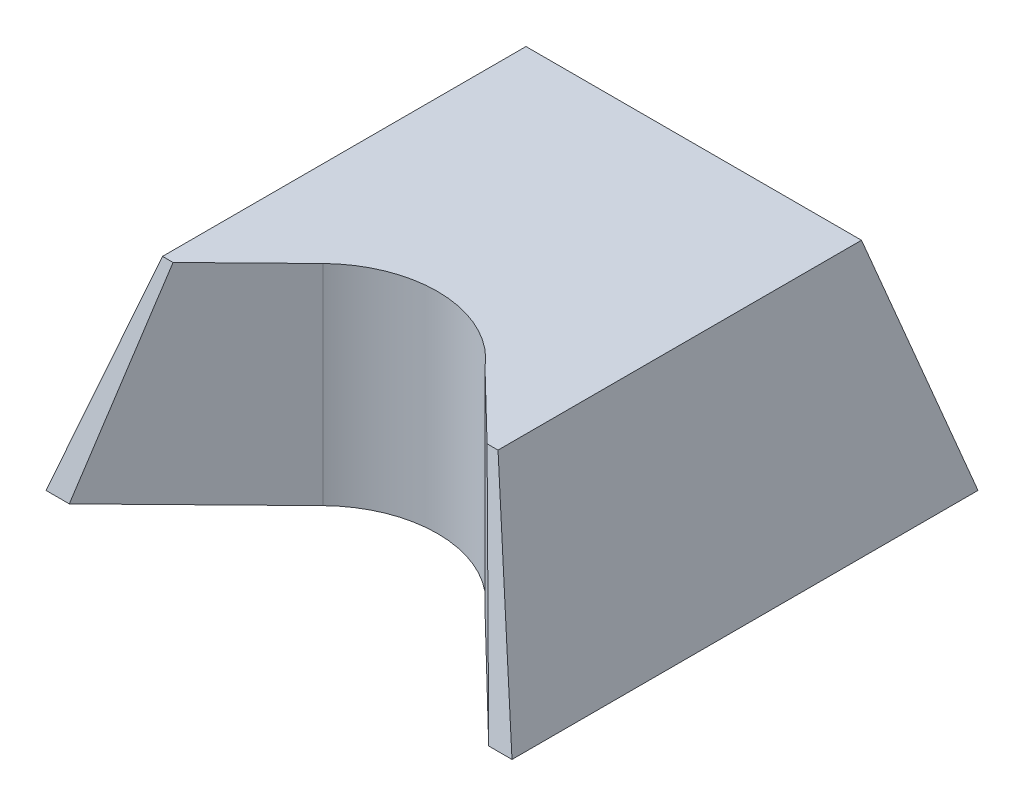
ISO-10303-21;
HEADER;
FILE_DESCRIPTION(('STEP AP214'),'2;1');
FILE_NAME('part.step','',(''),(''),'','','');
FILE_SCHEMA(('AUTOMOTIVE_DESIGN { 1 0 10303 214 1 1 1 1 }'));
ENDSEC;
DATA;
#1=APPLICATION_CONTEXT('core data for automotive mechanical design processes');
#2=APPLICATION_PROTOCOL_DEFINITION('international standard','automotive_design',2000,#1);
#3=PRODUCT_CONTEXT('',#1,'mechanical');
#4=PRODUCT('Part','Part','',(#3));
#5=PRODUCT_RELATED_PRODUCT_CATEGORY('part','',(#4));
#6=PRODUCT_DEFINITION_FORMATION('','',#4);
#7=PRODUCT_DEFINITION_CONTEXT('part definition',#1,'design');
#8=PRODUCT_DEFINITION('design','',#6,#7);
#9=PRODUCT_DEFINITION_SHAPE('','',#8);
#10=(LENGTH_UNIT() NAMED_UNIT(*) SI_UNIT(.MILLI.,.METRE.));
#11=(NAMED_UNIT(*) PLANE_ANGLE_UNIT() SI_UNIT($,.RADIAN.));
#12=(NAMED_UNIT(*) SI_UNIT($,.STERADIAN.) SOLID_ANGLE_UNIT());
#13=UNCERTAINTY_MEASURE_WITH_UNIT(LENGTH_MEASURE(1.E-05),#10,'distance_accuracy_value','');
#14=(GEOMETRIC_REPRESENTATION_CONTEXT(3) GLOBAL_UNCERTAINTY_ASSIGNED_CONTEXT((#13)) GLOBAL_UNIT_ASSIGNED_CONTEXT((#10,
#11,#12)) REPRESENTATION_CONTEXT('',''));
#15=CARTESIAN_POINT('',(0.,0.,0.));
#16=DIRECTION('',(0.,0.,1.));
#17=DIRECTION('',(1.,0.,0.));
#18=AXIS2_PLACEMENT_3D('',#15,#16,#17);
#19=CARTESIAN_POINT('',(50.,45.,-9.));
#20=DIRECTION('',(0.,-1.,0.));
#21=DIRECTION('',(0.,0.,-1.));
#22=AXIS2_PLACEMENT_3D('',#19,#20,#21);
#23=CYLINDRICAL_SURFACE('',#22,26.75);
#24=CARTESIAN_POINT('',(50.,0.,-9.));
#25=DIRECTION('',(0.,-1.,0.));
#26=DIRECTION('',(0.,0.,-1.));
#27=AXIS2_PLACEMENT_3D('',#24,#25,#26);
#28=CIRCLE('',#27,26.75);
#29=CARTESIAN_POINT('',(31.311151046317,0.,-28.1386892128594));
#30=VERTEX_POINT('',#29);
#31=CARTESIAN_POINT('',(70.5138595947822,0.,-26.1681118509159));
#32=VERTEX_POINT('',#31);
#33=EDGE_CURVE('E408',#30,#32,#28,.T.);
#34=ORIENTED_EDGE('',*,*,#33,.F.);
#35=DIRECTION('',(0.,-1.,0.));
#36=VECTOR('',#35,1.);
#37=CARTESIAN_POINT('',(31.311151046317,45.,-28.1386892128594));
#38=LINE('',#37,#36);
#39=CARTESIAN_POINT('',(31.311151046317,43.25,-28.1386892128594));
#40=VERTEX_POINT('',#39);
#41=EDGE_CURVE('E378',#40,#30,#38,.T.);
#42=ORIENTED_EDGE('',*,*,#41,.F.);
#43=CARTESIAN_POINT('',(50.,43.25,-9.));
#44=DIRECTION('',(0.,1.,0.));
#45=DIRECTION('',(0.,0.,1.));
#46=AXIS2_PLACEMENT_3D('',#43,#44,#45);
#47=CIRCLE('',#46,26.75);
#48=CARTESIAN_POINT('',(70.5138595947822,43.25,-26.1681118509159));
#49=VERTEX_POINT('',#48);
#50=EDGE_CURVE('E371',#40,#49,#47,.F.);
#51=ORIENTED_EDGE('',*,*,#50,.T.);
#52=DIRECTION('',(0.,-1.,0.));
#53=VECTOR('',#52,1.);
#54=CARTESIAN_POINT('',(70.5138595947822,43.25,-26.1681118509159));
#55=LINE('',#54,#53);
#56=EDGE_CURVE('E386',#49,#32,#55,.T.);
#57=ORIENTED_EDGE('',*,*,#56,.T.);
#58=EDGE_LOOP('',(#34,#42,#51,#57));
#59=FACE_BOUND('',#58,.T.);
#60=DIRECTION('',(0.,-1.,0.));
#61=VECTOR('',#60,1.);
#62=CARTESIAN_POINT('',(55.,15.75,-35.2785558963958));
#63=LINE('',#62,#61);
#64=CARTESIAN_POINT('',(55.,15.75,-35.2785558963958));
#65=VERTEX_POINT('',#64);
#66=CARTESIAN_POINT('',(55.,12.75,-35.2785558963958));
#67=VERTEX_POINT('',#66);
#68=EDGE_CURVE('E59',#65,#67,#63,.T.);
#69=ORIENTED_EDGE('',*,*,#68,.F.);
#70=CARTESIAN_POINT('',(50.,15.75,-8.99999999999898));
#71=DIRECTION('',(0.,1.,0.));
#72=DIRECTION('',(0.,0.,-1.));
#73=AXIS2_PLACEMENT_3D('',#70,#71,#72);
#74=CIRCLE('',#73,26.750000000001);
#75=CARTESIAN_POINT('',(45.,15.75,-35.2785558963958));
#76=VERTEX_POINT('',#75);
#77=EDGE_CURVE('E290',#65,#76,#74,.T.);
#78=ORIENTED_EDGE('',*,*,#77,.T.);
#79=DIRECTION('',(0.,-1.,0.));
#80=VECTOR('',#79,1.);
#81=CARTESIAN_POINT('',(45.,15.75,-35.2785558963958));
#82=LINE('',#81,#80);
#83=CARTESIAN_POINT('',(45.,12.75,-35.2785558963958));
#84=VERTEX_POINT('',#83);
#85=EDGE_CURVE('E302',#76,#84,#82,.T.);
#86=ORIENTED_EDGE('',*,*,#85,.T.);
#87=CARTESIAN_POINT('',(50.,12.75,-8.99999999999898));
#88=DIRECTION('',(0.,1.,0.));
#89=DIRECTION('',(0.,0.,-1.));
#90=AXIS2_PLACEMENT_3D('',#87,#88,#89);
#91=CIRCLE('',#90,26.750000000001);
#92=EDGE_CURVE('E282',#67,#84,#91,.T.);
#93=ORIENTED_EDGE('',*,*,#92,.F.);
#94=EDGE_LOOP('',(#69,#78,#86,#93));
#95=FACE_BOUND('',#94,.T.);
#96=ADVANCED_FACE('F35',(#59,#95),#23,.T.);
#97=CARTESIAN_POINT('',(100.,-0.415542908334733,-98.3000517386306));
#98=DIRECTION('',(0.,0.23745309047699,-0.971399006496778));
#99=DIRECTION('',(0.,0.971399006496778,0.23745309047699));
#100=AXIS2_PLACEMENT_3D('',#97,#98,#99);
#101=PLANE('',#100);
#102=DIRECTION('',(-1.,0.,0.));
#103=VECTOR('',#102,1.);
#104=CARTESIAN_POINT('',(86.,43.25,-87.6262523610377));
#105=LINE('',#104,#103);
#106=CARTESIAN_POINT('',(84.7117088516525,43.25,-87.6262523610377));
#107=VERTEX_POINT('',#106);
#108=CARTESIAN_POINT('',(15.2882911483475,43.25,-87.6262523610377));
#109=VERTEX_POINT('',#108);
#110=EDGE_CURVE('E359',#107,#109,#105,.T.);
#111=ORIENTED_EDGE('',*,*,#110,.T.);
#112=DIRECTION('',(-0.289290778575371,-0.929863216849409,-0.227299897452078));
#113=VECTOR('',#112,1.);
#114=CARTESIAN_POINT('',(14.8375814124481,41.8012901346092,-87.9803814392444));
#115=LINE('',#114,#113);
#116=CARTESIAN_POINT('',(1.83273559279194,0.,-98.1984745832599));
#117=VERTEX_POINT('',#116);
#118=EDGE_CURVE('E365',#109,#117,#115,.T.);
#119=ORIENTED_EDGE('',*,*,#118,.T.);
#120=DIRECTION('',(1.,0.,0.));
#121=VECTOR('',#120,1.);
#122=CARTESIAN_POINT('',(0.,0.,-98.1984745832599));
#123=LINE('',#122,#121);
#124=CARTESIAN_POINT('',(98.1672644072081,0.,-98.1984745832599));
#125=VERTEX_POINT('',#124);
#126=EDGE_CURVE('E396',#117,#125,#123,.T.);
#127=ORIENTED_EDGE('',*,*,#126,.T.);
#128=DIRECTION('',(-0.289290778575371,0.929863216849409,0.227299897452078));
#129=VECTOR('',#128,1.);
#130=CARTESIAN_POINT('',(98.4391051802077,-0.873773913213176,-98.4120637620454));
#131=LINE('',#130,#129);
#132=EDGE_CURVE('E368',#125,#107,#131,.T.);
#133=ORIENTED_EDGE('',*,*,#132,.T.);
#134=EDGE_LOOP('',(#111,#119,#127,#133));
#135=FACE_BOUND('',#134,.T.);
#136=DIRECTION('',(0.,-0.971399006496777,-0.237453090476993));
#137=VECTOR('',#136,1.);
#138=CARTESIAN_POINT('',(67.,9.,-95.9984745832599));
#139=LINE('',#138,#137);
#140=CARTESIAN_POINT('',(67.,9.,-95.9984745832599));
#141=VERTEX_POINT('',#140);
#142=CARTESIAN_POINT('',(67.,6.5,-96.609585694371));
#143=VERTEX_POINT('',#142);
#144=EDGE_CURVE('E327',#141,#143,#139,.T.);
#145=ORIENTED_EDGE('',*,*,#144,.T.);
#146=DIRECTION('',(-1.,0.,0.));
#147=VECTOR('',#146,1.);
#148=CARTESIAN_POINT('',(67.,6.5,-96.609585694371));
#149=LINE('',#148,#147);
#150=CARTESIAN_POINT('',(27.,6.5,-96.609585694371));
#151=VERTEX_POINT('',#150);
#152=EDGE_CURVE('E345',#143,#151,#149,.T.);
#153=ORIENTED_EDGE('',*,*,#152,.T.);
#154=DIRECTION('',(0.,-0.971399006496777,-0.237453090476993));
#155=VECTOR('',#154,1.);
#156=CARTESIAN_POINT('',(27.,9.,-95.9984745832599));
#157=LINE('',#156,#155);
#158=CARTESIAN_POINT('',(27.,9.,-95.9984745832599));
#159=VERTEX_POINT('',#158);
#160=EDGE_CURVE('E338',#159,#151,#157,.T.);
#161=ORIENTED_EDGE('',*,*,#160,.F.);
#162=DIRECTION('',(-1.,0.,0.));
#163=VECTOR('',#162,1.);
#164=CARTESIAN_POINT('',(67.,9.,-95.9984745832599));
#165=LINE('',#164,#163);
#166=EDGE_CURVE('E348',#141,#159,#165,.T.);
#167=ORIENTED_EDGE('',*,*,#166,.F.);
#168=EDGE_LOOP('',(#145,#153,#161,#167));
#169=FACE_BOUND('',#168,.T.);
#170=ADVANCED_FACE('F519',(#135,#169),#101,.F.);
#171=CARTESIAN_POINT('',(0.,0.,-100.));
#172=DIRECTION('',(0.,-1.,0.));
#173=DIRECTION('',(0.,0.,-1.));
#174=AXIS2_PLACEMENT_3D('',#171,#172,#173);
#175=PLANE('',#174);
#176=DIRECTION('',(0.715465017303156,0.,-0.698648559016187));
#177=VECTOR('',#176,1.);
#178=CARTESIAN_POINT('',(5.,0.,0.));
#179=LINE('',#178,#177);
#180=CARTESIAN_POINT('',(5.,0.,0.));
#181=VERTEX_POINT('',#180);
#182=CARTESIAN_POINT('',(32.5337860245953,0.,-26.8866254325789));
#183=VERTEX_POINT('',#182);
#184=EDGE_CURVE('E416',#181,#183,#179,.T.);
#185=ORIENTED_EDGE('',*,*,#184,.F.);
#186=DIRECTION('',(1.,0.,0.));
#187=VECTOR('',#186,1.);
#188=CARTESIAN_POINT('',(0.,0.,0.));
#189=LINE('',#188,#187);
#190=CARTESIAN_POINT('',(0.,0.,0.));
#191=VERTEX_POINT('',#190);
#192=EDGE_CURVE('E459',#191,#181,#189,.T.);
#193=ORIENTED_EDGE('',*,*,#192,.F.);
#194=DIRECTION('',(0.,0.,1.));
#195=VECTOR('',#194,1.);
#196=CARTESIAN_POINT('',(0.,0.,-100.));
#197=LINE('',#196,#195);
#198=CARTESIAN_POINT('',(0.,0.,-100.));
#199=VERTEX_POINT('',#198);
#200=EDGE_CURVE('E458',#199,#191,#197,.T.);
#201=ORIENTED_EDGE('',*,*,#200,.F.);
#202=DIRECTION('',(1.,0.,0.));
#203=VECTOR('',#202,1.);
#204=CARTESIAN_POINT('',(0.,0.,-100.));
#205=LINE('',#204,#203);
#206=CARTESIAN_POINT('',(100.,0.,-100.));
#207=VERTEX_POINT('',#206);
#208=EDGE_CURVE('E455',#199,#207,#205,.T.);
#209=ORIENTED_EDGE('',*,*,#208,.T.);
#210=DIRECTION('',(0.,0.,1.));
#211=VECTOR('',#210,1.);
#212=CARTESIAN_POINT('',(100.,0.,-100.));
#213=LINE('',#212,#211);
#214=CARTESIAN_POINT('',(100.,0.,0.));
#215=VERTEX_POINT('',#214);
#216=EDGE_CURVE('E468',#207,#215,#213,.T.);
#217=ORIENTED_EDGE('',*,*,#216,.T.);
#218=CARTESIAN_POINT('',(95.,0.,0.));
#219=VERTEX_POINT('',#218);
#220=EDGE_CURVE('E454',#219,#215,#189,.T.);
#221=ORIENTED_EDGE('',*,*,#220,.F.);
#222=DIRECTION('',(0.718091480026377,0.,0.695948723911128));
#223=VECTOR('',#222,1.);
#224=CARTESIAN_POINT('',(69.2292971033368,0.,-24.9760487265032));
#225=LINE('',#224,#223);
#226=CARTESIAN_POINT('',(69.2292971033368,0.,-24.9760487265032));
#227=VERTEX_POINT('',#226);
#228=EDGE_CURVE('E421',#227,#219,#225,.T.);
#229=ORIENTED_EDGE('',*,*,#228,.F.);
#230=CARTESIAN_POINT('',(50.,0.,-9.));
#231=DIRECTION('',(0.,-1.,0.));
#232=DIRECTION('',(0.,0.,-1.));
#233=AXIS2_PLACEMENT_3D('',#230,#231,#232);
#234=CIRCLE('',#233,25.);
#235=EDGE_CURVE('E430',#183,#227,#234,.T.);
#236=ORIENTED_EDGE('',*,*,#235,.F.);
#237=EDGE_LOOP('',(#185,#193,#201,#209,#217,#221,#229,#236));
#238=FACE_BOUND('',#237,.T.);
#239=DIRECTION('',(1.,0.,0.));
#240=VECTOR('',#239,1.);
#241=CARTESIAN_POINT('',(0.,0.,-1.80152541674009));
#242=LINE('',#241,#240);
#243=CARTESIAN_POINT('',(1.83273559279194,0.,-1.80152541674007));
#244=VERTEX_POINT('',#243);
#245=CARTESIAN_POINT('',(4.34005218991756,0.,-1.80152541674007));
#246=VERTEX_POINT('',#245);
#247=EDGE_CURVE('E393',#244,#246,#242,.T.);
#248=ORIENTED_EDGE('',*,*,#247,.T.);
#249=DIRECTION('',(0.715465017303156,0.,-0.698648559016187));
#250=VECTOR('',#249,1.);
#251=CARTESIAN_POINT('',(51.2037744033328,0.,-47.5637516649932));
#252=LINE('',#251,#250);
#253=EDGE_CURVE('E344',#246,#30,#252,.T.);
#254=ORIENTED_EDGE('',*,*,#253,.T.);
#255=ORIENTED_EDGE('',*,*,#33,.T.);
#256=DIRECTION('',(0.718091480026377,0.,0.695948723911128));
#257=VECTOR('',#256,1.);
#258=CARTESIAN_POINT('',(-2.74483515095145,0.,-97.1678333931009));
#259=LINE('',#258,#257);
#260=CARTESIAN_POINT('',(95.6557091514206,0.,-1.80152541674007));
#261=VERTEX_POINT('',#260);
#262=EDGE_CURVE('E372',#32,#261,#259,.T.);
#263=ORIENTED_EDGE('',*,*,#262,.T.);
#264=DIRECTION('',(1.,0.,0.));
#265=VECTOR('',#264,1.);
#266=CARTESIAN_POINT('',(0.,0.,-1.80152541674009));
#267=LINE('',#266,#265);
#268=CARTESIAN_POINT('',(98.1672644072081,0.,-1.80152541674007));
#269=VERTEX_POINT('',#268);
#270=EDGE_CURVE('E367',#261,#269,#267,.T.);
#271=ORIENTED_EDGE('',*,*,#270,.T.);
#272=DIRECTION('',(0.,0.,1.));
#273=VECTOR('',#272,1.);
#274=CARTESIAN_POINT('',(98.1672644072081,0.,-100.));
#275=LINE('',#274,#273);
#276=EDGE_CURVE('E381',#125,#269,#275,.T.);
#277=ORIENTED_EDGE('',*,*,#276,.F.);
#278=ORIENTED_EDGE('',*,*,#126,.F.);
#279=DIRECTION('',(0.,0.,1.));
#280=VECTOR('',#279,1.);
#281=CARTESIAN_POINT('',(1.83273559279194,0.,-100.));
#282=LINE('',#281,#280);
#283=EDGE_CURVE('E397',#117,#244,#282,.T.);
#284=ORIENTED_EDGE('',*,*,#283,.T.);
#285=EDGE_LOOP('',(#248,#254,#255,#263,#271,#277,#278,#284));
#286=FACE_BOUND('',#285,.T.);
#287=ADVANCED_FACE('F484',(#238,#286),#175,.T.);
#288=CARTESIAN_POINT('',(100.,0.,0.));
#289=DIRECTION('',(0.,-0.23745309047699,-0.971399006496778));
#290=DIRECTION('',(0.,0.971399006496778,-0.23745309047699));
#291=AXIS2_PLACEMENT_3D('',#288,#289,#290);
#292=PLANE('',#291);
#293=ORIENTED_EDGE('',*,*,#192,.T.);
#294=DIRECTION('',(0.23628308413727,0.943893126301529,-0.230729430873707));
#295=VECTOR('',#294,1.);
#296=CARTESIAN_POINT('',(10.3038211056949,21.1874680029571,-5.17915884516728));
#297=LINE('',#296,#295);
#298=CARTESIAN_POINT('',(16.264769802742,45.,-11.));
#299=VERTEX_POINT('',#298);
#300=EDGE_CURVE('E11',#181,#299,#297,.T.);
#301=ORIENTED_EDGE('',*,*,#300,.T.);
#302=DIRECTION('',(-1.,0.,0.));
#303=VECTOR('',#302,1.);
#304=CARTESIAN_POINT('',(100.,45.,-11.));
#305=LINE('',#304,#303);
#306=CARTESIAN_POINT('',(14.,45.,-11.));
#307=VERTEX_POINT('',#306);
#308=EDGE_CURVE('E436',#299,#307,#305,.T.);
#309=ORIENTED_EDGE('',*,*,#308,.T.);
#310=DIRECTION('',(-0.289290778575371,-0.929863216849409,0.227299897452078));
#311=VECTOR('',#310,1.);
#312=CARTESIAN_POINT('',(19.8522630230572,63.8108454312553,-15.5982066609735));
#313=LINE('',#312,#311);
#314=EDGE_CURVE('E443',#307,#191,#313,.T.);
#315=ORIENTED_EDGE('',*,*,#314,.T.);
#316=EDGE_LOOP('',(#293,#301,#309,#315));
#317=FACE_BOUND('',#316,.T.);
#318=ADVANCED_FACE('F501',(#317),#292,.F.);
#319=CARTESIAN_POINT('',(14.,45.,-100.));
#320=DIRECTION('',(-0.954856776330784,0.297066552636244,0.));
#321=DIRECTION('',(-0.297066552636244,-0.954856776330784,0.));
#322=AXIS2_PLACEMENT_3D('',#319,#320,#321);
#323=PLANE('',#322);
#324=ORIENTED_EDGE('',*,*,#314,.F.);
#325=DIRECTION('',(0.,0.,1.));
#326=VECTOR('',#325,1.);
#327=CARTESIAN_POINT('',(14.,45.,-100.));
#328=LINE('',#327,#326);
#329=CARTESIAN_POINT('',(14.,45.,-89.));
#330=VERTEX_POINT('',#329);
#331=EDGE_CURVE('E462',#330,#307,#328,.T.);
#332=ORIENTED_EDGE('',*,*,#331,.F.);
#333=DIRECTION('',(-0.289290778575371,-0.929863216849409,-0.227299897452078));
#334=VECTOR('',#333,1.);
#335=CARTESIAN_POINT('',(13.2766865926558,42.6750640478224,-89.568317677199));
#336=LINE('',#335,#334);
#337=EDGE_CURVE('E451',#330,#199,#336,.T.);
#338=ORIENTED_EDGE('',*,*,#337,.T.);
#339=ORIENTED_EDGE('',*,*,#200,.T.);
#340=EDGE_LOOP('',(#324,#332,#338,#339));
#341=FACE_BOUND('',#340,.T.);
#342=ADVANCED_FACE('F37',(#341),#323,.T.);
#343=CARTESIAN_POINT('',(86.,45.,-100.));
#344=DIRECTION('',(0.,1.,0.));
#345=DIRECTION('',(0.,0.,1.));
#346=AXIS2_PLACEMENT_3D('',#343,#344,#345);
#347=PLANE('',#346);
#348=DIRECTION('',(0.715465017303156,0.,-0.698648559016187));
#349=VECTOR('',#348,1.);
#350=CARTESIAN_POINT('',(5.,45.,0.));
#351=LINE('',#350,#349);
#352=CARTESIAN_POINT('',(32.5337860245953,45.,-26.8866254325789));
#353=VERTEX_POINT('',#352);
#354=EDGE_CURVE('E417',#299,#353,#351,.T.);
#355=ORIENTED_EDGE('',*,*,#354,.T.);
#356=CARTESIAN_POINT('',(50.,45.,-9.));
#357=DIRECTION('',(0.,-1.,0.));
#358=DIRECTION('',(0.,0.,-1.));
#359=AXIS2_PLACEMENT_3D('',#356,#357,#358);
#360=CIRCLE('',#359,25.);
#361=CARTESIAN_POINT('',(69.2292971033368,45.,-24.9760487265032));
#362=VERTEX_POINT('',#361);
#363=EDGE_CURVE('E420',#353,#362,#360,.T.);
#364=ORIENTED_EDGE('',*,*,#363,.T.);
#365=DIRECTION('',(0.718091480026377,0.,0.695948723911128));
#366=VECTOR('',#365,1.);
#367=CARTESIAN_POINT('',(69.2292971033368,45.,-24.9760487265032));
#368=LINE('',#367,#366);
#369=CARTESIAN_POINT('',(83.6500168634567,45.,-11.));
#370=VERTEX_POINT('',#369);
#371=EDGE_CURVE('E424',#362,#370,#368,.T.);
#372=ORIENTED_EDGE('',*,*,#371,.T.);
#373=CARTESIAN_POINT('',(86.,45.,-11.));
#374=VERTEX_POINT('',#373);
#375=EDGE_CURVE('E438',#374,#370,#305,.T.);
#376=ORIENTED_EDGE('',*,*,#375,.F.);
#377=DIRECTION('',(0.,0.,1.));
#378=VECTOR('',#377,1.);
#379=CARTESIAN_POINT('',(86.,45.,-100.));
#380=LINE('',#379,#378);
#381=CARTESIAN_POINT('',(86.,45.,-89.));
#382=VERTEX_POINT('',#381);
#383=EDGE_CURVE('E465',#382,#374,#380,.T.);
#384=ORIENTED_EDGE('',*,*,#383,.F.);
#385=DIRECTION('',(-1.,0.,0.));
#386=VECTOR('',#385,1.);
#387=CARTESIAN_POINT('',(100.,45.,-89.));
#388=LINE('',#387,#386);
#389=EDGE_CURVE('E445',#382,#330,#388,.T.);
#390=ORIENTED_EDGE('',*,*,#389,.T.);
#391=ORIENTED_EDGE('',*,*,#331,.T.);
#392=ORIENTED_EDGE('',*,*,#308,.F.);
#393=EDGE_LOOP('',(#355,#364,#372,#376,#384,#390,#391,#392));
#394=FACE_BOUND('',#393,.T.);
#395=ADVANCED_FACE('F493',(#394),#347,.T.);
#396=CARTESIAN_POINT('',(100.,0.,-100.));
#397=DIRECTION('',(0.954856776330784,0.297066552636244,0.));
#398=DIRECTION('',(-0.297066552636244,0.954856776330784,0.));
#399=AXIS2_PLACEMENT_3D('',#396,#397,#398);
#400=PLANE('',#399);
#401=DIRECTION('',(-0.289290778575371,0.929863216849409,-0.227299897452078));
#402=VECTOR('',#401,1.);
#403=CARTESIAN_POINT('',(93.4244235695986,21.135781383433,-5.16652433817251));
#404=LINE('',#403,#402);
#405=EDGE_CURVE('E441',#215,#374,#404,.T.);
#406=ORIENTED_EDGE('',*,*,#405,.F.);
#407=ORIENTED_EDGE('',*,*,#216,.F.);
#408=DIRECTION('',(-0.289290778575371,0.929863216849409,0.227299897452078));
#409=VECTOR('',#408,1.);
#410=CARTESIAN_POINT('',(100.,0.,-100.));
#411=LINE('',#410,#409);
#412=EDGE_CURVE('E448',#207,#382,#411,.T.);
#413=ORIENTED_EDGE('',*,*,#412,.T.);
#414=ORIENTED_EDGE('',*,*,#383,.T.);
#415=EDGE_LOOP('',(#406,#407,#413,#414));
#416=FACE_BOUND('',#415,.T.);
#417=ADVANCED_FACE('F490',(#416),#400,.T.);
#418=CARTESIAN_POINT('',(100.,0.,-100.));
#419=DIRECTION('',(0.,0.23745309047699,-0.971399006496778));
#420=DIRECTION('',(0.,0.971399006496778,0.23745309047699));
#421=AXIS2_PLACEMENT_3D('',#418,#419,#420);
#422=PLANE('',#421);
#423=ORIENTED_EDGE('',*,*,#389,.F.);
#424=ORIENTED_EDGE('',*,*,#412,.F.);
#425=ORIENTED_EDGE('',*,*,#208,.F.);
#426=ORIENTED_EDGE('',*,*,#337,.F.);
#427=EDGE_LOOP('',(#423,#424,#425,#426));
#428=FACE_BOUND('',#427,.T.);
#429=ADVANCED_FACE('F507',(#428),#422,.T.);
#430=ORIENTED_EDGE('',*,*,#375,.T.);
#431=DIRECTION('',(0.237969608014224,-0.94349323975308,0.230631680828531));
#432=VECTOR('',#431,1.);
#433=CARTESIAN_POINT('',(95.2831476716922,-1.12261358214055,0.274416653412135));
#434=LINE('',#433,#432);
#435=EDGE_CURVE('E44',#370,#219,#434,.T.);
#436=ORIENTED_EDGE('',*,*,#435,.T.);
#437=ORIENTED_EDGE('',*,*,#220,.T.);
#438=ORIENTED_EDGE('',*,*,#405,.T.);
#439=EDGE_LOOP('',(#430,#436,#437,#438));
#440=FACE_BOUND('',#439,.T.);
#441=ADVANCED_FACE('F476',(#440),#292,.F.);
#442=CARTESIAN_POINT('',(5.,45.,0.));
#443=DIRECTION('',(-0.698648559016187,0.,-0.715465017303156));
#444=DIRECTION('',(-0.715465017303156,0.,0.698648559016187));
#445=AXIS2_PLACEMENT_3D('',#442,#443,#444);
#446=PLANE('',#445);
#447=ORIENTED_EDGE('',*,*,#184,.T.);
#448=DIRECTION('',(0.,-1.,0.));
#449=VECTOR('',#448,1.);
#450=CARTESIAN_POINT('',(32.5337860245953,45.,-26.8866254325789));
#451=LINE('',#450,#449);
#452=EDGE_CURVE('E427',#353,#183,#451,.T.);
#453=ORIENTED_EDGE('',*,*,#452,.F.);
#454=ORIENTED_EDGE('',*,*,#354,.F.);
#455=ORIENTED_EDGE('',*,*,#300,.F.);
#456=EDGE_LOOP('',(#447,#453,#454,#455));
#457=FACE_BOUND('',#456,.T.);
#458=ADVANCED_FACE('F508',(#457),#446,.F.);
#459=CARTESIAN_POINT('',(69.2292971033368,45.,-24.9760487265032));
#460=DIRECTION('',(0.695948723911128,0.,-0.718091480026377));
#461=DIRECTION('',(-0.718091480026377,0.,-0.695948723911128));
#462=AXIS2_PLACEMENT_3D('',#459,#460,#461);
#463=PLANE('',#462);
#464=ORIENTED_EDGE('',*,*,#371,.F.);
#465=DIRECTION('',(0.,-1.,0.));
#466=VECTOR('',#465,1.);
#467=CARTESIAN_POINT('',(69.2292971033368,45.,-24.9760487265032));
#468=LINE('',#467,#466);
#469=EDGE_CURVE('E434',#362,#227,#468,.T.);
#470=ORIENTED_EDGE('',*,*,#469,.T.);
#471=ORIENTED_EDGE('',*,*,#228,.T.);
#472=ORIENTED_EDGE('',*,*,#435,.F.);
#473=EDGE_LOOP('',(#464,#470,#471,#472));
#474=FACE_BOUND('',#473,.T.);
#475=ADVANCED_FACE('F495',(#474),#463,.F.);
#476=CARTESIAN_POINT('',(50.,45.,-9.));
#477=DIRECTION('',(0.,-1.,0.));
#478=DIRECTION('',(0.,0.,-1.));
#479=AXIS2_PLACEMENT_3D('',#476,#477,#478);
#480=CYLINDRICAL_SURFACE('',#479,25.);
#481=ORIENTED_EDGE('',*,*,#235,.T.);
#482=ORIENTED_EDGE('',*,*,#469,.F.);
#483=ORIENTED_EDGE('',*,*,#363,.F.);
#484=ORIENTED_EDGE('',*,*,#452,.T.);
#485=EDGE_LOOP('',(#481,#482,#483,#484));
#486=FACE_BOUND('',#485,.T.);
#487=ADVANCED_FACE('F497',(#486),#480,.F.);
#488=CARTESIAN_POINT('',(70.4472073701812,45.,-26.2327088165494));
#489=DIRECTION('',(0.695948723911128,0.,-0.718091480026377));
#490=DIRECTION('',(-0.718091480026377,0.,-0.695948723911128));
#491=AXIS2_PLACEMENT_3D('',#488,#489,#490);
#492=PLANE('',#491);
#493=DIRECTION('',(0.237969608014224,-0.94349323975308,0.230631680828531));
#494=VECTOR('',#493,1.);
#495=CARTESIAN_POINT('',(96.0005980343861,-1.36740288921493,-1.4672713771542));
#496=LINE('',#495,#494);
#497=CARTESIAN_POINT('',(84.8987550381166,42.648780114937,-12.2267827781691));
#498=VERTEX_POINT('',#497);
#499=EDGE_CURVE('E356',#498,#261,#496,.T.);
#500=ORIENTED_EDGE('',*,*,#499,.T.);
#501=ORIENTED_EDGE('',*,*,#262,.F.);
#502=ORIENTED_EDGE('',*,*,#56,.F.);
#503=DIRECTION('',(0.718091480026377,0.,0.695948723911128));
#504=VECTOR('',#503,1.);
#505=CARTESIAN_POINT('',(70.4472073701812,43.25,-26.2327088165494));
#506=LINE('',#505,#504);
#507=CARTESIAN_POINT('',(84.7117088516525,43.25,-12.4080612898948));
#508=VERTEX_POINT('',#507);
#509=EDGE_CURVE('E375',#49,#508,#506,.T.);
#510=ORIENTED_EDGE('',*,*,#509,.T.);
#511=DIRECTION('',(-0.285470721642866,0.917584462423498,-0.276668070806304));
#512=VECTOR('',#511,1.);
#513=CARTESIAN_POINT('',(90.3685951888534,25.067151058997,-6.92560823594598));
#514=LINE('',#513,#512);
#515=EDGE_CURVE('E355',#498,#508,#514,.T.);
#516=ORIENTED_EDGE('',*,*,#515,.F.);
#517=EDGE_LOOP('',(#500,#501,#502,#510,#516));
#518=FACE_BOUND('',#517,.T.);
#519=ADVANCED_FACE('F529',(#518),#492,.T.);
#520=CARTESIAN_POINT('',(98.3290006414211,-0.519866467113427,-100.));
#521=DIRECTION('',(0.954856776330784,0.297066552636244,0.));
#522=DIRECTION('',(-0.297066552636244,0.954856776330784,0.));
#523=AXIS2_PLACEMENT_3D('',#520,#521,#522);
#524=PLANE('',#523);
#525=ORIENTED_EDGE('',*,*,#515,.T.);
#526=DIRECTION('',(0.,0.,1.));
#527=VECTOR('',#526,1.);
#528=CARTESIAN_POINT('',(84.7117088516525,43.25,-100.));
#529=LINE('',#528,#527);
#530=EDGE_CURVE('E364',#107,#508,#529,.T.);
#531=ORIENTED_EDGE('',*,*,#530,.F.);
#532=ORIENTED_EDGE('',*,*,#132,.F.);
#533=ORIENTED_EDGE('',*,*,#276,.T.);
#534=DIRECTION('',(-0.289290778575371,0.929863216849409,-0.227299897452078));
#535=VECTOR('',#534,1.);
#536=CARTESIAN_POINT('',(91.8635287498063,20.2620074702198,-6.75446057612714));
#537=LINE('',#536,#535);
#538=EDGE_CURVE('E360',#269,#498,#537,.T.);
#539=ORIENTED_EDGE('',*,*,#538,.T.);
#540=EDGE_LOOP('',(#525,#531,#532,#533,#539));
#541=FACE_BOUND('',#540,.T.);
#542=ADVANCED_FACE('F535',(#541),#524,.F.);
#543=CARTESIAN_POINT('',(100.,-0.415542908334733,-1.69994826136936));
#544=DIRECTION('',(0.,-0.23745309047699,-0.971399006496778));
#545=DIRECTION('',(0.,0.971399006496778,-0.23745309047699));
#546=AXIS2_PLACEMENT_3D('',#543,#544,#545);
#547=PLANE('',#546);
#548=ORIENTED_EDGE('',*,*,#247,.F.);
#549=DIRECTION('',(-0.289290778575371,-0.929863216849409,0.227299897452078));
#550=VECTOR('',#549,1.);
#551=CARTESIAN_POINT('',(21.4131578428495,62.9370715180421,-17.1861428989282));
#552=LINE('',#551,#550);
#553=CARTESIAN_POINT('',(14.6661828086609,41.2503660510079,-11.8849482292087));
#554=VERTEX_POINT('',#553);
#555=EDGE_CURVE('E357',#554,#244,#552,.T.);
#556=ORIENTED_EDGE('',*,*,#555,.F.);
#557=DIRECTION('',(0.23628308413727,0.943893126301529,-0.230729430873707));
#558=VECTOR('',#557,1.);
#559=CARTESIAN_POINT('',(9.5825033885269,20.9423102352254,-6.92075680757295));
#560=LINE('',#559,#558);
#561=EDGE_CURVE('E352',#246,#554,#560,.T.);
#562=ORIENTED_EDGE('',*,*,#561,.F.);
#563=EDGE_LOOP('',(#548,#556,#562));
#564=FACE_BOUND('',#563,.T.);
#565=ADVANCED_FACE('F540',(#564),#547,.T.);
#566=CARTESIAN_POINT('',(15.6709993585789,44.4801335328866,-100.));
#567=DIRECTION('',(-0.954856776330784,0.297066552636244,0.));
#568=DIRECTION('',(-0.297066552636244,-0.954856776330784,0.));
#569=AXIS2_PLACEMENT_3D('',#566,#567,#568);
#570=PLANE('',#569);
#571=ORIENTED_EDGE('',*,*,#555,.T.);
#572=ORIENTED_EDGE('',*,*,#283,.F.);
#573=ORIENTED_EDGE('',*,*,#118,.F.);
#574=DIRECTION('',(0.,0.,1.));
#575=VECTOR('',#574,1.);
#576=CARTESIAN_POINT('',(15.2882911483475,43.25,-100.));
#577=LINE('',#576,#575);
#578=CARTESIAN_POINT('',(15.2882911483475,43.25,-12.4924343879483));
#579=VERTEX_POINT('',#578);
#580=EDGE_CURVE('E361',#109,#579,#577,.T.);
#581=ORIENTED_EDGE('',*,*,#580,.T.);
#582=DIRECTION('',(0.285304943988287,0.917051605676637,-0.278599069384201));
#583=VECTOR('',#582,1.);
#584=CARTESIAN_POINT('',(13.9157345362322,38.8382108896295,-11.1521386697355));
#585=LINE('',#584,#583);
#586=EDGE_CURVE('E414',#554,#579,#585,.T.);
#587=ORIENTED_EDGE('',*,*,#586,.F.);
#588=EDGE_LOOP('',(#571,#572,#573,#581,#587));
#589=FACE_BOUND('',#588,.T.);
#590=ADVANCED_FACE('F561',(#589),#570,.F.);
#591=CARTESIAN_POINT('',(86.,43.25,-100.));
#592=DIRECTION('',(0.,1.,0.));
#593=DIRECTION('',(0.,0.,1.));
#594=AXIS2_PLACEMENT_3D('',#591,#592,#593);
#595=PLANE('',#594);
#596=ORIENTED_EDGE('',*,*,#580,.F.);
#597=ORIENTED_EDGE('',*,*,#110,.F.);
#598=ORIENTED_EDGE('',*,*,#530,.T.);
#599=ORIENTED_EDGE('',*,*,#509,.F.);
#600=ORIENTED_EDGE('',*,*,#50,.F.);
#601=DIRECTION('',(0.715465017303156,0.,-0.698648559016187));
#602=VECTOR('',#601,1.);
#603=CARTESIAN_POINT('',(3.77736502172167,43.25,-1.25206378028052));
#604=LINE('',#603,#602);
#605=EDGE_CURVE('E369',#579,#40,#604,.T.);
#606=ORIENTED_EDGE('',*,*,#605,.F.);
#607=EDGE_LOOP('',(#596,#597,#598,#599,#600,#606));
#608=FACE_BOUND('',#607,.T.);
#609=ADVANCED_FACE('F554',(#608),#595,.F.);
#610=ORIENTED_EDGE('',*,*,#538,.F.);
#611=ORIENTED_EDGE('',*,*,#270,.F.);
#612=ORIENTED_EDGE('',*,*,#499,.F.);
#613=EDGE_LOOP('',(#610,#611,#612));
#614=FACE_BOUND('',#613,.T.);
#615=ADVANCED_FACE('F546',(#614),#547,.T.);
#616=CARTESIAN_POINT('',(3.77736502172167,45.,-1.25206378028052));
#617=DIRECTION('',(-0.698648559016187,0.,-0.715465017303156));
#618=DIRECTION('',(-0.715465017303156,0.,0.698648559016187));
#619=AXIS2_PLACEMENT_3D('',#616,#617,#618);
#620=PLANE('',#619);
#621=ORIENTED_EDGE('',*,*,#586,.T.);
#622=ORIENTED_EDGE('',*,*,#605,.T.);
#623=ORIENTED_EDGE('',*,*,#41,.T.);
#624=ORIENTED_EDGE('',*,*,#253,.F.);
#625=ORIENTED_EDGE('',*,*,#561,.T.);
#626=EDGE_LOOP('',(#621,#622,#623,#624,#625));
#627=FACE_BOUND('',#626,.T.);
#628=ADVANCED_FACE('F566',(#627),#620,.T.);
#629=CARTESIAN_POINT('',(67.,6.5,-90.9984745832599));
#630=DIRECTION('',(0.,0.,1.));
#631=DIRECTION('',(0.,-1.,0.));
#632=AXIS2_PLACEMENT_3D('',#629,#630,#631);
#633=PLANE('',#632);
#634=DIRECTION('',(0.,1.,0.));
#635=VECTOR('',#634,1.);
#636=CARTESIAN_POINT('',(27.,6.5,-90.9984745832599));
#637=LINE('',#636,#635);
#638=CARTESIAN_POINT('',(27.,6.5,-90.9984745832599));
#639=VERTEX_POINT('',#638);
#640=CARTESIAN_POINT('',(27.,9.,-90.9984745832599));
#641=VERTEX_POINT('',#640);
#642=EDGE_CURVE('E314',#639,#641,#637,.T.);
#643=ORIENTED_EDGE('',*,*,#642,.F.);
#644=DIRECTION('',(-1.,0.,0.));
#645=VECTOR('',#644,1.);
#646=CARTESIAN_POINT('',(67.,6.5,-90.9984745832599));
#647=LINE('',#646,#645);
#648=CARTESIAN_POINT('',(67.,6.5,-90.9984745832599));
#649=VERTEX_POINT('',#648);
#650=EDGE_CURVE('E342',#649,#639,#647,.T.);
#651=ORIENTED_EDGE('',*,*,#650,.F.);
#652=DIRECTION('',(0.,1.,0.));
#653=VECTOR('',#652,1.);
#654=CARTESIAN_POINT('',(67.,6.5,-90.9984745832599));
#655=LINE('',#654,#653);
#656=CARTESIAN_POINT('',(67.,9.,-90.9984745832599));
#657=VERTEX_POINT('',#656);
#658=EDGE_CURVE('E320',#649,#657,#655,.T.);
#659=ORIENTED_EDGE('',*,*,#658,.T.);
#660=DIRECTION('',(-1.,0.,0.));
#661=VECTOR('',#660,1.);
#662=CARTESIAN_POINT('',(67.,9.,-90.9984745832599));
#663=LINE('',#662,#661);
#664=EDGE_CURVE('E333',#657,#641,#663,.T.);
#665=ORIENTED_EDGE('',*,*,#664,.T.);
#666=EDGE_LOOP('',(#643,#651,#659,#665));
#667=FACE_BOUND('',#666,.T.);
#668=ADVANCED_FACE('F568',(#667),#633,.T.);
#669=CARTESIAN_POINT('',(67.,6.5,-96.609585694371));
#670=DIRECTION('',(0.,-1.,0.));
#671=DIRECTION('',(0.,0.,-1.));
#672=AXIS2_PLACEMENT_3D('',#669,#670,#671);
#673=PLANE('',#672);
#674=DIRECTION('',(0.,0.,1.));
#675=VECTOR('',#674,1.);
#676=CARTESIAN_POINT('',(27.,6.5,-96.609585694371));
#677=LINE('',#676,#675);
#678=EDGE_CURVE('E324',#151,#639,#677,.T.);
#679=ORIENTED_EDGE('',*,*,#678,.F.);
#680=ORIENTED_EDGE('',*,*,#152,.F.);
#681=DIRECTION('',(0.,0.,1.));
#682=VECTOR('',#681,1.);
#683=CARTESIAN_POINT('',(67.,6.5,-96.609585694371));
#684=LINE('',#683,#682);
#685=EDGE_CURVE('E330',#143,#649,#684,.T.);
#686=ORIENTED_EDGE('',*,*,#685,.T.);
#687=ORIENTED_EDGE('',*,*,#650,.T.);
#688=EDGE_LOOP('',(#679,#680,#686,#687));
#689=FACE_BOUND('',#688,.T.);
#690=ADVANCED_FACE('F573',(#689),#673,.T.);
#691=CARTESIAN_POINT('',(67.,9.,-90.9984745832599));
#692=DIRECTION('',(0.,1.,0.));
#693=DIRECTION('',(0.,0.,1.));
#694=AXIS2_PLACEMENT_3D('',#691,#692,#693);
#695=PLANE('',#694);
#696=DIRECTION('',(0.,0.,-1.));
#697=VECTOR('',#696,1.);
#698=CARTESIAN_POINT('',(27.,9.,-90.9984745832599));
#699=LINE('',#698,#697);
#700=EDGE_CURVE('E336',#641,#159,#699,.T.);
#701=ORIENTED_EDGE('',*,*,#700,.F.);
#702=ORIENTED_EDGE('',*,*,#664,.F.);
#703=DIRECTION('',(0.,0.,-1.));
#704=VECTOR('',#703,1.);
#705=CARTESIAN_POINT('',(67.,9.,-90.9984745832599));
#706=LINE('',#705,#704);
#707=EDGE_CURVE('E323',#657,#141,#706,.T.);
#708=ORIENTED_EDGE('',*,*,#707,.T.);
#709=ORIENTED_EDGE('',*,*,#166,.T.);
#710=EDGE_LOOP('',(#701,#702,#708,#709));
#711=FACE_BOUND('',#710,.T.);
#712=ADVANCED_FACE('F583',(#711),#695,.T.);
#713=CARTESIAN_POINT('',(67.,0.,0.));
#714=DIRECTION('',(-1.,0.,0.));
#715=DIRECTION('',(0.,0.,1.));
#716=AXIS2_PLACEMENT_3D('',#713,#714,#715);
#717=PLANE('',#716);
#718=ORIENTED_EDGE('',*,*,#658,.F.);
#719=ORIENTED_EDGE('',*,*,#685,.F.);
#720=ORIENTED_EDGE('',*,*,#144,.F.);
#721=ORIENTED_EDGE('',*,*,#707,.F.);
#722=EDGE_LOOP('',(#718,#719,#720,#721));
#723=FACE_BOUND('',#722,.T.);
#724=ADVANCED_FACE('F586',(#723),#717,.F.);
#725=CARTESIAN_POINT('',(27.,0.,0.));
#726=DIRECTION('',(-1.,0.,0.));
#727=DIRECTION('',(0.,0.,1.));
#728=AXIS2_PLACEMENT_3D('',#725,#726,#727);
#729=PLANE('',#728);
#730=ORIENTED_EDGE('',*,*,#642,.T.);
#731=ORIENTED_EDGE('',*,*,#700,.T.);
#732=ORIENTED_EDGE('',*,*,#160,.T.);
#733=ORIENTED_EDGE('',*,*,#678,.T.);
#734=EDGE_LOOP('',(#730,#731,#732,#733));
#735=FACE_BOUND('',#734,.T.);
#736=ADVANCED_FACE('F591',(#735),#729,.T.);
#737=CARTESIAN_POINT('',(55.,15.75,-39.));
#738=DIRECTION('',(1.,0.,0.));
#739=DIRECTION('',(0.,0.,-1.));
#740=AXIS2_PLACEMENT_3D('',#737,#738,#739);
#741=PLANE('',#740);
#742=DIRECTION('',(0.,0.,1.));
#743=VECTOR('',#742,1.);
#744=CARTESIAN_POINT('',(55.,12.75,-39.));
#745=LINE('',#744,#743);
#746=CARTESIAN_POINT('',(55.,12.75,-39.));
#747=VERTEX_POINT('',#746);
#748=EDGE_CURVE('E293',#747,#67,#745,.T.);
#749=ORIENTED_EDGE('',*,*,#748,.F.);
#750=DIRECTION('',(0.,-1.,0.));
#751=VECTOR('',#750,1.);
#752=CARTESIAN_POINT('',(55.,15.75,-39.));
#753=LINE('',#752,#751);
#754=CARTESIAN_POINT('',(55.,15.75,-39.));
#755=VERTEX_POINT('',#754);
#756=EDGE_CURVE('E315',#755,#747,#753,.T.);
#757=ORIENTED_EDGE('',*,*,#756,.F.);
#758=DIRECTION('',(0.,0.,1.));
#759=VECTOR('',#758,1.);
#760=CARTESIAN_POINT('',(55.,15.75,-39.));
#761=LINE('',#760,#759);
#762=EDGE_CURVE('E299',#755,#65,#761,.T.);
#763=ORIENTED_EDGE('',*,*,#762,.T.);
#764=ORIENTED_EDGE('',*,*,#68,.T.);
#765=EDGE_LOOP('',(#749,#757,#763,#764));
#766=FACE_BOUND('',#765,.T.);
#767=ADVANCED_FACE('F594',(#766),#741,.T.);
#768=CARTESIAN_POINT('',(50.,15.75,-39.));
#769=DIRECTION('',(0.,-1.,0.));
#770=DIRECTION('',(0.,0.,-1.));
#771=AXIS2_PLACEMENT_3D('',#768,#769,#770);
#772=CYLINDRICAL_SURFACE('',#771,5.00000000000005);
#773=CARTESIAN_POINT('',(50.,12.75,-39.));
#774=DIRECTION('',(0.,-1.,0.));
#775=DIRECTION('',(0.,0.,-1.));
#776=AXIS2_PLACEMENT_3D('',#773,#774,#775);
#777=CIRCLE('',#776,5.00000000000005);
#778=CARTESIAN_POINT('',(45.,12.75,-38.9999990587567));
#779=VERTEX_POINT('',#778);
#780=EDGE_CURVE('E308',#779,#747,#777,.T.);
#781=ORIENTED_EDGE('',*,*,#780,.F.);
#782=DIRECTION('',(0.,-1.,0.));
#783=VECTOR('',#782,1.);
#784=CARTESIAN_POINT('',(45.,15.75,-38.9999990587567));
#785=LINE('',#784,#783);
#786=CARTESIAN_POINT('',(45.,15.75,-38.9999990587567));
#787=VERTEX_POINT('',#786);
#788=EDGE_CURVE('E317',#787,#779,#785,.T.);
#789=ORIENTED_EDGE('',*,*,#788,.F.);
#790=CARTESIAN_POINT('',(50.,15.75,-39.));
#791=DIRECTION('',(0.,-1.,0.));
#792=DIRECTION('',(0.,0.,-1.));
#793=AXIS2_PLACEMENT_3D('',#790,#791,#792);
#794=CIRCLE('',#793,5.00000000000005);
#795=EDGE_CURVE('E296',#787,#755,#794,.T.);
#796=ORIENTED_EDGE('',*,*,#795,.T.);
#797=ORIENTED_EDGE('',*,*,#756,.T.);
#798=EDGE_LOOP('',(#781,#789,#796,#797));
#799=FACE_BOUND('',#798,.T.);
#800=ADVANCED_FACE('F603',(#799),#772,.T.);
#801=CARTESIAN_POINT('',(45.,15.75,-35.2785558963958));
#802=DIRECTION('',(-1.,0.,0.));
#803=DIRECTION('',(0.,0.,1.));
#804=AXIS2_PLACEMENT_3D('',#801,#802,#803);
#805=PLANE('',#804);
#806=DIRECTION('',(0.,0.,-1.));
#807=VECTOR('',#806,1.);
#808=CARTESIAN_POINT('',(45.,12.75,-35.2785558963958));
#809=LINE('',#808,#807);
#810=EDGE_CURVE('E305',#84,#779,#809,.T.);
#811=ORIENTED_EDGE('',*,*,#810,.F.);
#812=ORIENTED_EDGE('',*,*,#85,.F.);
#813=DIRECTION('',(0.,0.,-1.));
#814=VECTOR('',#813,1.);
#815=CARTESIAN_POINT('',(45.,15.75,-35.2785558963958));
#816=LINE('',#815,#814);
#817=EDGE_CURVE('E292',#76,#787,#816,.T.);
#818=ORIENTED_EDGE('',*,*,#817,.T.);
#819=ORIENTED_EDGE('',*,*,#788,.T.);
#820=EDGE_LOOP('',(#811,#812,#818,#819));
#821=FACE_BOUND('',#820,.T.);
#822=ADVANCED_FACE('F599',(#821),#805,.T.);
#823=CARTESIAN_POINT('',(50.,15.75,-8.99999999999898));
#824=DIRECTION('',(0.,-1.,0.));
#825=DIRECTION('',(0.,0.,-1.));
#826=AXIS2_PLACEMENT_3D('',#823,#824,#825);
#827=PLANE('',#826);
#828=CARTESIAN_POINT('',(50.,15.75,-39.));
#829=DIRECTION('',(0.,1.,0.));
#830=DIRECTION('',(0.,0.,1.));
#831=AXIS2_PLACEMENT_3D('',#828,#829,#830);
#832=CIRCLE('',#831,1.7);
#833=CARTESIAN_POINT('',(50.,15.75,-37.3));
#834=VERTEX_POINT('',#833);
#835=EDGE_CURVE('E260',#834,#834,#832,.T.);
#836=ORIENTED_EDGE('',*,*,#835,.F.);
#837=EDGE_LOOP('',(#836));
#838=FACE_BOUND('',#837,.T.);
#839=ORIENTED_EDGE('',*,*,#77,.F.);
#840=ORIENTED_EDGE('',*,*,#762,.F.);
#841=ORIENTED_EDGE('',*,*,#795,.F.);
#842=ORIENTED_EDGE('',*,*,#817,.F.);
#843=EDGE_LOOP('',(#839,#840,#841,#842));
#844=FACE_BOUND('',#843,.T.);
#845=ADVANCED_FACE('F602',(#838,#844),#827,.F.);
#846=CARTESIAN_POINT('',(50.,12.75,-8.99999999999898));
#847=DIRECTION('',(0.,-1.,0.));
#848=DIRECTION('',(0.,0.,-1.));
#849=AXIS2_PLACEMENT_3D('',#846,#847,#848);
#850=PLANE('',#849);
#851=DIRECTION('',(-0.500000000000001,0.,-0.866025403784438));
#852=VECTOR('',#851,1.);
#853=CARTESIAN_POINT('',(48.3256842193501,12.75,-36.1));
#854=LINE('',#853,#852);
#855=CARTESIAN_POINT('',(48.3256842193501,12.75,-36.1));
#856=VERTEX_POINT('',#855);
#857=CARTESIAN_POINT('',(46.6513684387002,12.75,-39.));
#858=VERTEX_POINT('',#857);
#859=EDGE_CURVE('E51',#856,#858,#854,.T.);
#860=ORIENTED_EDGE('',*,*,#859,.F.);
#861=DIRECTION('',(-1.,0.,0.));
#862=VECTOR('',#861,1.);
#863=CARTESIAN_POINT('',(51.6743157806499,12.75,-36.1));
#864=LINE('',#863,#862);
#865=CARTESIAN_POINT('',(51.6743157806499,12.75,-36.1));
#866=VERTEX_POINT('',#865);
#867=EDGE_CURVE('E254',#866,#856,#864,.T.);
#868=ORIENTED_EDGE('',*,*,#867,.F.);
#869=DIRECTION('',(-0.500000000000001,0.,0.866025403784438));
#870=VECTOR('',#869,1.);
#871=CARTESIAN_POINT('',(53.3486315612999,12.75,-39.));
#872=LINE('',#871,#870);
#873=CARTESIAN_POINT('',(53.3486315612999,12.75,-39.));
#874=VERTEX_POINT('',#873);
#875=EDGE_CURVE('E257',#874,#866,#872,.T.);
#876=ORIENTED_EDGE('',*,*,#875,.F.);
#877=DIRECTION('',(0.5,0.,0.866025403784439));
#878=VECTOR('',#877,1.);
#879=CARTESIAN_POINT('',(51.6743157806499,12.75,-41.9));
#880=LINE('',#879,#878);
#881=CARTESIAN_POINT('',(51.6743157806499,12.75,-41.9));
#882=VERTEX_POINT('',#881);
#883=EDGE_CURVE('E275',#882,#874,#880,.T.);
#884=ORIENTED_EDGE('',*,*,#883,.F.);
#885=DIRECTION('',(1.,0.,0.));
#886=VECTOR('',#885,1.);
#887=CARTESIAN_POINT('',(48.3256842193501,12.75,-41.9));
#888=LINE('',#887,#886);
#889=CARTESIAN_POINT('',(48.3256842193501,12.75,-41.9));
#890=VERTEX_POINT('',#889);
#891=EDGE_CURVE('E272',#890,#882,#888,.T.);
#892=ORIENTED_EDGE('',*,*,#891,.F.);
#893=DIRECTION('',(0.5,0.,-0.866025403784439));
#894=VECTOR('',#893,1.);
#895=CARTESIAN_POINT('',(46.6513684387002,12.75,-39.));
#896=LINE('',#895,#894);
#897=EDGE_CURVE('E270',#858,#890,#896,.T.);
#898=ORIENTED_EDGE('',*,*,#897,.F.);
#899=EDGE_LOOP('',(#860,#868,#876,#884,#892,#898));
#900=FACE_BOUND('',#899,.T.);
#901=ORIENTED_EDGE('',*,*,#92,.T.);
#902=ORIENTED_EDGE('',*,*,#810,.T.);
#903=ORIENTED_EDGE('',*,*,#780,.T.);
#904=ORIENTED_EDGE('',*,*,#748,.T.);
#905=EDGE_LOOP('',(#901,#902,#903,#904));
#906=FACE_BOUND('',#905,.T.);
#907=ADVANCED_FACE('F611',(#900,#906),#850,.T.);
#908=CARTESIAN_POINT('',(48.3256842193501,15.15,-36.1));
#909=DIRECTION('',(-0.866025403784438,0.,0.500000000000001));
#910=DIRECTION('',(0.500000000000001,0.,0.866025403784438));
#911=AXIS2_PLACEMENT_3D('',#908,#909,#910);
#912=PLANE('',#911);
#913=ORIENTED_EDGE('',*,*,#859,.T.);
#914=DIRECTION('',(0.,-1.,0.));
#915=VECTOR('',#914,1.);
#916=CARTESIAN_POINT('',(46.6513684387002,15.15,-39.));
#917=LINE('',#916,#915);
#918=CARTESIAN_POINT('',(46.6513684387002,15.15,-39.));
#919=VERTEX_POINT('',#918);
#920=EDGE_CURVE('E231',#919,#858,#917,.T.);
#921=ORIENTED_EDGE('',*,*,#920,.F.);
#922=DIRECTION('',(-0.500000000000001,0.,-0.866025403784438));
#923=VECTOR('',#922,1.);
#924=CARTESIAN_POINT('',(48.3256842193501,15.15,-36.1));
#925=LINE('',#924,#923);
#926=CARTESIAN_POINT('',(48.3256842193501,15.15,-36.1));
#927=VERTEX_POINT('',#926);
#928=EDGE_CURVE('E235',#927,#919,#925,.T.);
#929=ORIENTED_EDGE('',*,*,#928,.F.);
#930=DIRECTION('',(0.,-1.,0.));
#931=VECTOR('',#930,1.);
#932=CARTESIAN_POINT('',(48.3256842193501,15.15,-36.1));
#933=LINE('',#932,#931);
#934=EDGE_CURVE('E280',#927,#856,#933,.T.);
#935=ORIENTED_EDGE('',*,*,#934,.T.);
#936=EDGE_LOOP('',(#913,#921,#929,#935));
#937=FACE_BOUND('',#936,.T.);
#938=ADVANCED_FACE('F233',(#937),#912,.F.);
#939=CARTESIAN_POINT('',(51.6743157806499,15.15,-36.1));
#940=DIRECTION('',(0.,0.,1.));
#941=DIRECTION('',(1.,0.,0.));
#942=AXIS2_PLACEMENT_3D('',#939,#940,#941);
#943=PLANE('',#942);
#944=ORIENTED_EDGE('',*,*,#867,.T.);
#945=ORIENTED_EDGE('',*,*,#934,.F.);
#946=DIRECTION('',(-1.,0.,0.));
#947=VECTOR('',#946,1.);
#948=CARTESIAN_POINT('',(51.6743157806499,15.15,-36.1));
#949=LINE('',#948,#947);
#950=CARTESIAN_POINT('',(51.6743157806499,15.15,-36.1));
#951=VERTEX_POINT('',#950);
#952=EDGE_CURVE('E241',#951,#927,#949,.T.);
#953=ORIENTED_EDGE('',*,*,#952,.F.);
#954=DIRECTION('',(0.,-1.,0.));
#955=VECTOR('',#954,1.);
#956=CARTESIAN_POINT('',(51.6743157806499,15.15,-36.1));
#957=LINE('',#956,#955);
#958=EDGE_CURVE('E283',#951,#866,#957,.T.);
#959=ORIENTED_EDGE('',*,*,#958,.T.);
#960=EDGE_LOOP('',(#944,#945,#953,#959));
#961=FACE_BOUND('',#960,.T.);
#962=ADVANCED_FACE('F620',(#961),#943,.F.);
#963=CARTESIAN_POINT('',(53.3486315612999,15.15,-39.));
#964=DIRECTION('',(0.866025403784438,0.,0.500000000000001));
#965=DIRECTION('',(0.500000000000001,0.,-0.866025403784438));
#966=AXIS2_PLACEMENT_3D('',#963,#964,#965);
#967=PLANE('',#966);
#968=ORIENTED_EDGE('',*,*,#875,.T.);
#969=ORIENTED_EDGE('',*,*,#958,.F.);
#970=DIRECTION('',(-0.500000000000001,0.,0.866025403784438));
#971=VECTOR('',#970,1.);
#972=CARTESIAN_POINT('',(53.3486315612999,15.15,-39.));
#973=LINE('',#972,#971);
#974=CARTESIAN_POINT('',(53.3486315612999,15.15,-39.));
#975=VERTEX_POINT('',#974);
#976=EDGE_CURVE('E266',#975,#951,#973,.T.);
#977=ORIENTED_EDGE('',*,*,#976,.F.);
#978=DIRECTION('',(0.,-1.,0.));
#979=VECTOR('',#978,1.);
#980=CARTESIAN_POINT('',(53.3486315612999,15.15,-39.));
#981=LINE('',#980,#979);
#982=EDGE_CURVE('E285',#975,#874,#981,.T.);
#983=ORIENTED_EDGE('',*,*,#982,.T.);
#984=EDGE_LOOP('',(#968,#969,#977,#983));
#985=FACE_BOUND('',#984,.T.);
#986=ADVANCED_FACE('F630',(#985),#967,.F.);
#987=CARTESIAN_POINT('',(51.6743157806499,15.15,-41.9));
#988=DIRECTION('',(0.866025403784439,0.,-0.5));
#989=DIRECTION('',(-0.5,0.,-0.866025403784439));
#990=AXIS2_PLACEMENT_3D('',#987,#988,#989);
#991=PLANE('',#990);
#992=ORIENTED_EDGE('',*,*,#883,.T.);
#993=ORIENTED_EDGE('',*,*,#982,.F.);
#994=DIRECTION('',(0.5,0.,0.866025403784439));
#995=VECTOR('',#994,1.);
#996=CARTESIAN_POINT('',(51.6743157806499,15.15,-41.9));
#997=LINE('',#996,#995);
#998=CARTESIAN_POINT('',(51.6743157806499,15.15,-41.9));
#999=VERTEX_POINT('',#998);
#1000=EDGE_CURVE('E263',#999,#975,#997,.T.);
#1001=ORIENTED_EDGE('',*,*,#1000,.F.);
#1002=DIRECTION('',(0.,-1.,0.));
#1003=VECTOR('',#1002,1.);
#1004=CARTESIAN_POINT('',(51.6743157806499,15.15,-41.9));
#1005=LINE('',#1004,#1003);
#1006=EDGE_CURVE('E287',#999,#882,#1005,.T.);
#1007=ORIENTED_EDGE('',*,*,#1006,.T.);
#1008=EDGE_LOOP('',(#992,#993,#1001,#1007));
#1009=FACE_BOUND('',#1008,.T.);
#1010=ADVANCED_FACE('F626',(#1009),#991,.F.);
#1011=CARTESIAN_POINT('',(48.3256842193501,15.15,-41.9));
#1012=DIRECTION('',(0.,0.,-1.));
#1013=DIRECTION('',(-1.,0.,0.));
#1014=AXIS2_PLACEMENT_3D('',#1011,#1012,#1013);
#1015=PLANE('',#1014);
#1016=ORIENTED_EDGE('',*,*,#891,.T.);
#1017=ORIENTED_EDGE('',*,*,#1006,.F.);
#1018=DIRECTION('',(1.,0.,0.));
#1019=VECTOR('',#1018,1.);
#1020=CARTESIAN_POINT('',(48.3256842193501,15.15,-41.9));
#1021=LINE('',#1020,#1019);
#1022=CARTESIAN_POINT('',(48.3256842193501,15.15,-41.9));
#1023=VERTEX_POINT('',#1022);
#1024=EDGE_CURVE('E249',#1023,#999,#1021,.T.);
#1025=ORIENTED_EDGE('',*,*,#1024,.F.);
#1026=DIRECTION('',(0.,-1.,0.));
#1027=VECTOR('',#1026,1.);
#1028=CARTESIAN_POINT('',(48.3256842193501,15.15,-41.9));
#1029=LINE('',#1028,#1027);
#1030=EDGE_CURVE('E240',#1023,#890,#1029,.T.);
#1031=ORIENTED_EDGE('',*,*,#1030,.T.);
#1032=EDGE_LOOP('',(#1016,#1017,#1025,#1031));
#1033=FACE_BOUND('',#1032,.T.);
#1034=ADVANCED_FACE('F623',(#1033),#1015,.F.);
#1035=CARTESIAN_POINT('',(46.6513684387002,15.15,-39.));
#1036=DIRECTION('',(-0.866025403784439,0.,-0.5));
#1037=DIRECTION('',(-0.5,0.,0.866025403784439));
#1038=AXIS2_PLACEMENT_3D('',#1035,#1036,#1037);
#1039=PLANE('',#1038);
#1040=ORIENTED_EDGE('',*,*,#897,.T.);
#1041=ORIENTED_EDGE('',*,*,#1030,.F.);
#1042=DIRECTION('',(0.5,0.,-0.866025403784439));
#1043=VECTOR('',#1042,1.);
#1044=CARTESIAN_POINT('',(46.6513684387002,15.15,-39.));
#1045=LINE('',#1044,#1043);
#1046=EDGE_CURVE('E244',#919,#1023,#1045,.T.);
#1047=ORIENTED_EDGE('',*,*,#1046,.F.);
#1048=ORIENTED_EDGE('',*,*,#920,.T.);
#1049=EDGE_LOOP('',(#1040,#1041,#1047,#1048));
#1050=FACE_BOUND('',#1049,.T.);
#1051=ADVANCED_FACE('F245',(#1050),#1039,.F.);
#1052=CARTESIAN_POINT('',(0.,15.15,0.));
#1053=DIRECTION('',(0.,-1.,0.));
#1054=DIRECTION('',(0.,0.,-1.));
#1055=AXIS2_PLACEMENT_3D('',#1052,#1053,#1054);
#1056=PLANE('',#1055);
#1057=CARTESIAN_POINT('',(50.,15.15,-39.));
#1058=DIRECTION('',(0.,-1.,0.));
#1059=DIRECTION('',(0.,0.,-1.));
#1060=AXIS2_PLACEMENT_3D('',#1057,#1058,#1059);
#1061=CIRCLE('',#1060,1.7);
#1062=CARTESIAN_POINT('',(50.,15.15,-40.7));
#1063=VERTEX_POINT('',#1062);
#1064=EDGE_CURVE('E39',#1063,#1063,#1061,.T.);
#1065=ORIENTED_EDGE('',*,*,#1064,.F.);
#1066=EDGE_LOOP('',(#1065));
#1067=FACE_BOUND('',#1066,.T.);
#1068=ORIENTED_EDGE('',*,*,#928,.T.);
#1069=ORIENTED_EDGE('',*,*,#1046,.T.);
#1070=ORIENTED_EDGE('',*,*,#1024,.T.);
#1071=ORIENTED_EDGE('',*,*,#1000,.T.);
#1072=ORIENTED_EDGE('',*,*,#976,.T.);
#1073=ORIENTED_EDGE('',*,*,#952,.T.);
#1074=EDGE_LOOP('',(#1068,#1069,#1070,#1071,#1072,#1073));
#1075=FACE_BOUND('',#1074,.T.);
#1076=ADVANCED_FACE('F251',(#1067,#1075),#1056,.T.);
#1077=CARTESIAN_POINT('',(50.,13.35,-39.));
#1078=DIRECTION('',(0.,1.,0.));
#1079=DIRECTION('',(0.,0.,1.));
#1080=AXIS2_PLACEMENT_3D('',#1077,#1078,#1079);
#1081=CYLINDRICAL_SURFACE('',#1080,1.7);
#1082=ORIENTED_EDGE('',*,*,#1064,.T.);
#1083=EDGE_LOOP('',(#1082));
#1084=FACE_BOUND('',#1083,.T.);
#1085=ORIENTED_EDGE('',*,*,#835,.T.);
#1086=EDGE_LOOP('',(#1085));
#1087=FACE_BOUND('',#1086,.T.);
#1088=ADVANCED_FACE('F640',(#1084,#1087),#1081,.F.);
#1089=CLOSED_SHELL('',(#96,#170,#287,#318,#342,#395,#417,#429,#441,#458,#475,#487,#519,#542,
#565,#590,#609,#615,#628,#668,#690,#712,#724,#736,#767,#800,#822,#845,#907,#938,#962,#986,#1010,
#1034,#1051,#1076,#1088));
#1090=MANIFOLD_SOLID_BREP('B2',#1089);
#1091=ADVANCED_BREP_SHAPE_REPRESENTATION('',(#18,#1090),#14);
#1092=SHAPE_DEFINITION_REPRESENTATION(#9,#1091);
ENDSEC;
END-ISO-10303-21;
